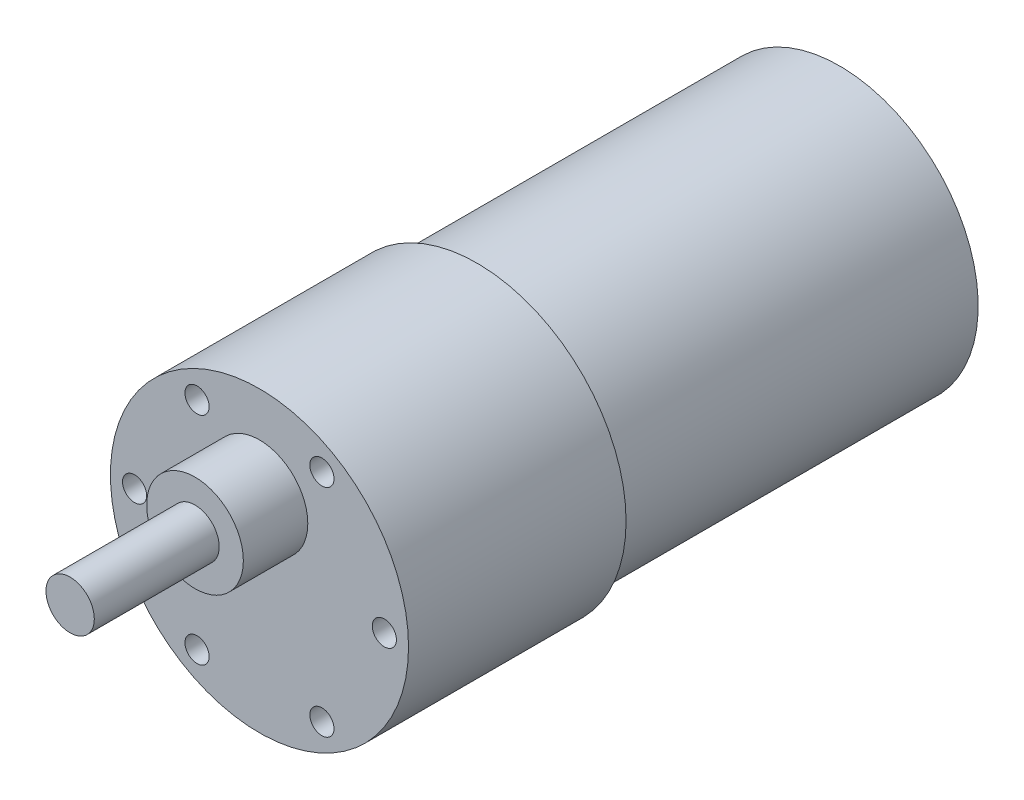
ISO-10303-21;
HEADER;
FILE_DESCRIPTION(('STEP AP214'),'2;1');
FILE_NAME('part.step','',(''),(''),'','','');
FILE_SCHEMA(('AUTOMOTIVE_DESIGN { 1 0 10303 214 1 1 1 1 }'));
ENDSEC;
DATA;
#1=APPLICATION_CONTEXT('core data for automotive mechanical design processes');
#2=APPLICATION_PROTOCOL_DEFINITION('international standard','automotive_design',2000,#1);
#3=PRODUCT_CONTEXT('',#1,'mechanical');
#4=PRODUCT('Part','Part','',(#3));
#5=PRODUCT_RELATED_PRODUCT_CATEGORY('part','',(#4));
#6=PRODUCT_DEFINITION_FORMATION('','',#4);
#7=PRODUCT_DEFINITION_CONTEXT('part definition',#1,'design');
#8=PRODUCT_DEFINITION('design','',#6,#7);
#9=PRODUCT_DEFINITION_SHAPE('','',#8);
#10=(LENGTH_UNIT() NAMED_UNIT(*) SI_UNIT(.MILLI.,.METRE.));
#11=(NAMED_UNIT(*) PLANE_ANGLE_UNIT() SI_UNIT($,.RADIAN.));
#12=(NAMED_UNIT(*) SI_UNIT($,.STERADIAN.) SOLID_ANGLE_UNIT());
#13=UNCERTAINTY_MEASURE_WITH_UNIT(LENGTH_MEASURE(1.E-05),#10,'distance_accuracy_value','');
#14=(GEOMETRIC_REPRESENTATION_CONTEXT(3) GLOBAL_UNCERTAINTY_ASSIGNED_CONTEXT((#13)) GLOBAL_UNIT_ASSIGNED_CONTEXT((#10,
#11,#12)) REPRESENTATION_CONTEXT('',''));
#15=CARTESIAN_POINT('',(0.,0.,0.));
#16=DIRECTION('',(0.,0.,1.));
#17=DIRECTION('',(1.,0.,0.));
#18=AXIS2_PLACEMENT_3D('',#15,#16,#17);
#19=CARTESIAN_POINT('',(0.,0.,45.));
#20=DIRECTION('',(0.,0.,-1.));
#21=DIRECTION('',(-1.,0.,0.));
#22=AXIS2_PLACEMENT_3D('',#19,#20,#21);
#23=CYLINDRICAL_SURFACE('',#22,17.2);
#24=CARTESIAN_POINT('',(0.,0.,45.));
#25=DIRECTION('',(0.,0.,1.));
#26=DIRECTION('',(1.,0.,0.));
#27=AXIS2_PLACEMENT_3D('',#24,#25,#26);
#28=CIRCLE('',#27,17.2);
#29=CARTESIAN_POINT('',(-17.2,0.,45.));
#30=VERTEX_POINT('',#29);
#31=EDGE_CURVE('E10',#30,#30,#28,.T.);
#32=CARTESIAN_POINT('',(0.,0.,0.));
#33=DIRECTION('',(0.,0.,1.));
#34=DIRECTION('',(1.,0.,0.));
#35=AXIS2_PLACEMENT_3D('',#32,#33,#34);
#36=CIRCLE('',#35,17.2);
#37=CARTESIAN_POINT('',(-17.2,0.,0.));
#38=VERTEX_POINT('',#37);
#39=EDGE_CURVE('E36',#38,#38,#36,.T.);
#40=CARTESIAN_POINT('',(-17.2,0.,45.));
#41=CARTESIAN_POINT('',(-17.2,0.,44.53125));
#42=CARTESIAN_POINT('',(-17.2,0.,44.0625));
#43=CARTESIAN_POINT('',(-17.2,0.,43.125));
#44=CARTESIAN_POINT('',(-17.2,0.,42.65625));
#45=CARTESIAN_POINT('',(-17.2,0.,41.71875));
#46=CARTESIAN_POINT('',(-17.2,0.,41.25));
#47=CARTESIAN_POINT('',(-17.2,0.,40.3125));
#48=CARTESIAN_POINT('',(-17.2,0.,39.84375));
#49=CARTESIAN_POINT('',(-17.2,0.,38.90625));
#50=CARTESIAN_POINT('',(-17.2,0.,38.4375));
#51=CARTESIAN_POINT('',(-17.2,0.,37.5));
#52=CARTESIAN_POINT('',(-17.2,0.,37.03125));
#53=CARTESIAN_POINT('',(-17.2,0.,36.09375));
#54=CARTESIAN_POINT('',(-17.2,0.,35.625));
#55=CARTESIAN_POINT('',(-17.2,0.,34.6875));
#56=CARTESIAN_POINT('',(-17.2,0.,34.21875));
#57=CARTESIAN_POINT('',(-17.2,0.,33.28125));
#58=CARTESIAN_POINT('',(-17.2,0.,32.8125));
#59=CARTESIAN_POINT('',(-17.2,0.,31.875));
#60=CARTESIAN_POINT('',(-17.2,0.,31.40625));
#61=CARTESIAN_POINT('',(-17.2,0.,30.46875));
#62=CARTESIAN_POINT('',(-17.2,0.,30.));
#63=CARTESIAN_POINT('',(-17.2,0.,29.0625));
#64=CARTESIAN_POINT('',(-17.2,0.,28.59375));
#65=CARTESIAN_POINT('',(-17.2,0.,27.65625));
#66=CARTESIAN_POINT('',(-17.2,0.,27.1875));
#67=CARTESIAN_POINT('',(-17.2,0.,26.25));
#68=CARTESIAN_POINT('',(-17.2,0.,25.78125));
#69=CARTESIAN_POINT('',(-17.2,0.,24.84375));
#70=CARTESIAN_POINT('',(-17.2,0.,24.375));
#71=CARTESIAN_POINT('',(-17.2,0.,23.4375));
#72=CARTESIAN_POINT('',(-17.2,0.,22.96875));
#73=CARTESIAN_POINT('',(-17.2,0.,22.03125));
#74=CARTESIAN_POINT('',(-17.2,0.,21.5625));
#75=CARTESIAN_POINT('',(-17.2,0.,20.625));
#76=CARTESIAN_POINT('',(-17.2,0.,20.15625));
#77=CARTESIAN_POINT('',(-17.2,0.,19.21875));
#78=CARTESIAN_POINT('',(-17.2,0.,18.75));
#79=CARTESIAN_POINT('',(-17.2,0.,17.8125));
#80=CARTESIAN_POINT('',(-17.2,0.,17.34375));
#81=CARTESIAN_POINT('',(-17.2,0.,16.40625));
#82=CARTESIAN_POINT('',(-17.2,0.,15.9375));
#83=CARTESIAN_POINT('',(-17.2,0.,15.));
#84=CARTESIAN_POINT('',(-17.2,0.,14.53125));
#85=CARTESIAN_POINT('',(-17.2,0.,13.59375));
#86=CARTESIAN_POINT('',(-17.2,0.,13.125));
#87=CARTESIAN_POINT('',(-17.2,0.,12.1875));
#88=CARTESIAN_POINT('',(-17.2,0.,11.71875));
#89=CARTESIAN_POINT('',(-17.2,0.,10.78125));
#90=CARTESIAN_POINT('',(-17.2,0.,10.3125));
#91=CARTESIAN_POINT('',(-17.2,0.,9.37499999999999));
#92=CARTESIAN_POINT('',(-17.2,0.,8.90624999999999));
#93=CARTESIAN_POINT('',(-17.2,0.,7.96874999999999));
#94=CARTESIAN_POINT('',(-17.2,0.,7.5));
#95=CARTESIAN_POINT('',(-17.2,0.,6.56249999999999));
#96=CARTESIAN_POINT('',(-17.2,0.,6.09374999999999));
#97=CARTESIAN_POINT('',(-17.2,0.,5.15624999999999));
#98=CARTESIAN_POINT('',(-17.2,0.,4.68749999999999));
#99=CARTESIAN_POINT('',(-17.2,0.,3.74999999999999));
#100=CARTESIAN_POINT('',(-17.2,0.,3.28124999999999));
#101=CARTESIAN_POINT('',(-17.2,0.,2.34374999999999));
#102=CARTESIAN_POINT('',(-17.2,0.,1.87499999999999));
#103=CARTESIAN_POINT('',(-17.2,0.,0.937499999999992));
#104=CARTESIAN_POINT('',(-17.2,0.,0.468749999999993));
#105=CARTESIAN_POINT('',(-17.2,0.,0.));
#106=B_SPLINE_CURVE_WITH_KNOTS('',3,(#40,#41,#42,#43,#44,#45,#46,#47,#48,#49,#50,#51,#52,#53,
#54,#55,#56,#57,#58,#59,#60,#61,#62,#63,#64,#65,#66,#67,#68,#69,#70,#71,#72,#73,#74,#75,#76,#77,
#78,#79,#80,#81,#82,#83,#84,#85,#86,#87,#88,#89,#90,#91,#92,#93,#94,#95,#96,#97,#98,#99,#100,
#101,#102,#103,#104,#105),.UNSPECIFIED.,.F.,.F.,(4,2,2,2,2,2,2,2,2,2,2,2,2,2,2,2,2,2,2,2,2,2,2,
2,2,2,2,2,2,2,2,2,4),(0.,1.40625,2.8125,4.21874999999999,5.625,7.03125,8.43749999999999,9.84375,
11.25,12.65625,14.0625,15.46875,16.875,18.28125,19.6875,21.09375,22.5,23.90625,25.3125,26.71875,
28.125,29.53125,30.9375,32.34375,33.75,35.15625,36.5625,37.96875,39.375,40.78125,42.1875,
43.59375,45.),.UNSPECIFIED.);
#107=EDGE_CURVE('BSEAM33',#30,#38,#106,.T.);
#108=ORIENTED_EDGE('',*,*,#31,.F.);
#109=ORIENTED_EDGE('',*,*,#39,.T.);
#110=ORIENTED_EDGE('',*,*,#107,.T.);
#111=ORIENTED_EDGE('',*,*,#107,.F.);
#112=EDGE_LOOP('',(#108,#110,#109,#111));
#113=FACE_BOUND('',#112,.T.);
#114=ADVANCED_FACE('F33',(#113),#23,.T.);
#115=CARTESIAN_POINT('',(0.,0.,0.));
#116=DIRECTION('',(0.,0.,1.));
#117=DIRECTION('',(1.,0.,0.));
#118=AXIS2_PLACEMENT_3D('',#115,#116,#117);
#119=PLANE('',#118);
#120=ORIENTED_EDGE('',*,*,#39,.F.);
#121=EDGE_LOOP('',(#120));
#122=FACE_BOUND('',#121,.T.);
#123=ADVANCED_FACE('F142',(#122),#119,.F.);
#124=CARTESIAN_POINT('',(0.,0.,72.));
#125=DIRECTION('',(0.,0.,-1.));
#126=DIRECTION('',(-1.,0.,0.));
#127=AXIS2_PLACEMENT_3D('',#124,#125,#126);
#128=CYLINDRICAL_SURFACE('',#127,18.5);
#129=CARTESIAN_POINT('',(0.,0.,72.));
#130=DIRECTION('',(0.,0.,1.));
#131=DIRECTION('',(1.,0.,0.));
#132=AXIS2_PLACEMENT_3D('',#129,#130,#131);
#133=CIRCLE('',#132,18.5);
#134=CARTESIAN_POINT('',(18.5,0.,72.));
#135=VERTEX_POINT('',#134);
#136=EDGE_CURVE('E43',#135,#135,#133,.T.);
#137=ORIENTED_EDGE('',*,*,#136,.F.);
#138=EDGE_LOOP('',(#137));
#139=FACE_BOUND('',#138,.T.);
#140=CARTESIAN_POINT('',(0.,0.,45.));
#141=DIRECTION('',(0.,0.,1.));
#142=DIRECTION('',(1.,0.,0.));
#143=AXIS2_PLACEMENT_3D('',#140,#141,#142);
#144=CIRCLE('',#143,18.5);
#145=CARTESIAN_POINT('',(18.5,0.,45.));
#146=VERTEX_POINT('',#145);
#147=EDGE_CURVE('E45',#146,#146,#144,.T.);
#148=ORIENTED_EDGE('',*,*,#147,.T.);
#149=EDGE_LOOP('',(#148));
#150=FACE_BOUND('',#149,.T.);
#151=ADVANCED_FACE('F124',(#139,#150),#128,.T.);
#152=CARTESIAN_POINT('',(0.,0.,72.));
#153=DIRECTION('',(0.,0.,1.));
#154=DIRECTION('',(1.,0.,0.));
#155=AXIS2_PLACEMENT_3D('',#152,#153,#154);
#156=PLANE('',#155);
#157=CARTESIAN_POINT('',(0.,7.,72.));
#158=DIRECTION('',(0.,0.,1.));
#159=DIRECTION('',(1.,0.,0.));
#160=AXIS2_PLACEMENT_3D('',#157,#158,#159);
#161=CIRCLE('',#160,6.);
#162=CARTESIAN_POINT('',(6.,7.,72.));
#163=VERTEX_POINT('',#162);
#164=EDGE_CURVE('E87',#163,#163,#161,.T.);
#165=ORIENTED_EDGE('',*,*,#164,.F.);
#166=EDGE_LOOP('',(#165));
#167=FACE_BOUND('',#166,.T.);
#168=CARTESIAN_POINT('',(-7.75000000000001,13.4233937586588,72.));
#169=DIRECTION('',(0.,0.,1.));
#170=DIRECTION('',(1.,0.,0.));
#171=AXIS2_PLACEMENT_3D('',#168,#169,#170);
#172=CIRCLE('',#171,1.5);
#173=CARTESIAN_POINT('',(-6.25000000000001,13.4233937586588,72.));
#174=VERTEX_POINT('',#173);
#175=EDGE_CURVE('E82',#174,#174,#172,.T.);
#176=ORIENTED_EDGE('',*,*,#175,.F.);
#177=EDGE_LOOP('',(#176));
#178=FACE_BOUND('',#177,.T.);
#179=CARTESIAN_POINT('',(7.75,13.4233937586588,72.));
#180=DIRECTION('',(0.,0.,1.));
#181=DIRECTION('',(1.,0.,0.));
#182=AXIS2_PLACEMENT_3D('',#179,#180,#181);
#183=CIRCLE('',#182,1.5);
#184=CARTESIAN_POINT('',(9.25,13.4233937586588,72.));
#185=VERTEX_POINT('',#184);
#186=EDGE_CURVE('E76',#185,#185,#183,.T.);
#187=ORIENTED_EDGE('',*,*,#186,.F.);
#188=EDGE_LOOP('',(#187));
#189=FACE_BOUND('',#188,.T.);
#190=CARTESIAN_POINT('',(15.5,0.,72.));
#191=DIRECTION('',(0.,0.,1.));
#192=DIRECTION('',(1.,0.,0.));
#193=AXIS2_PLACEMENT_3D('',#190,#191,#192);
#194=CIRCLE('',#193,1.5);
#195=CARTESIAN_POINT('',(17.,0.,72.));
#196=VERTEX_POINT('',#195);
#197=EDGE_CURVE('E70',#196,#196,#194,.T.);
#198=ORIENTED_EDGE('',*,*,#197,.F.);
#199=EDGE_LOOP('',(#198));
#200=FACE_BOUND('',#199,.T.);
#201=CARTESIAN_POINT('',(7.75000000000001,-13.4233937586588,72.));
#202=DIRECTION('',(0.,0.,1.));
#203=DIRECTION('',(1.,0.,0.));
#204=AXIS2_PLACEMENT_3D('',#201,#202,#203);
#205=CIRCLE('',#204,1.5);
#206=CARTESIAN_POINT('',(9.25000000000001,-13.4233937586588,72.));
#207=VERTEX_POINT('',#206);
#208=EDGE_CURVE('E64',#207,#207,#205,.T.);
#209=ORIENTED_EDGE('',*,*,#208,.F.);
#210=EDGE_LOOP('',(#209));
#211=FACE_BOUND('',#210,.T.);
#212=CARTESIAN_POINT('',(-7.74999999999999,-13.4233937586588,72.));
#213=DIRECTION('',(0.,0.,1.));
#214=DIRECTION('',(1.,0.,0.));
#215=AXIS2_PLACEMENT_3D('',#212,#213,#214);
#216=CIRCLE('',#215,1.5);
#217=CARTESIAN_POINT('',(-6.24999999999999,-13.4233937586588,72.));
#218=VERTEX_POINT('',#217);
#219=EDGE_CURVE('E57',#218,#218,#216,.T.);
#220=ORIENTED_EDGE('',*,*,#219,.F.);
#221=EDGE_LOOP('',(#220));
#222=FACE_BOUND('',#221,.T.);
#223=CARTESIAN_POINT('',(-15.5,0.,72.));
#224=DIRECTION('',(0.,0.,1.));
#225=DIRECTION('',(1.,0.,0.));
#226=AXIS2_PLACEMENT_3D('',#223,#224,#225);
#227=CIRCLE('',#226,1.5);
#228=CARTESIAN_POINT('',(-14.,0.,72.));
#229=VERTEX_POINT('',#228);
#230=EDGE_CURVE('E51',#229,#229,#227,.T.);
#231=ORIENTED_EDGE('',*,*,#230,.F.);
#232=EDGE_LOOP('',(#231));
#233=FACE_BOUND('',#232,.T.);
#234=ORIENTED_EDGE('',*,*,#136,.T.);
#235=EDGE_LOOP('',(#234));
#236=FACE_BOUND('',#235,.T.);
#237=ADVANCED_FACE('F120',(#167,#178,#189,#200,#211,#222,#233,#236),#156,.T.);
#238=CARTESIAN_POINT('',(0.,0.,45.));
#239=DIRECTION('',(0.,0.,1.));
#240=DIRECTION('',(1.,0.,0.));
#241=AXIS2_PLACEMENT_3D('',#238,#239,#240);
#242=PLANE('',#241);
#243=ORIENTED_EDGE('',*,*,#31,.T.);
#244=EDGE_LOOP('',(#243));
#245=FACE_BOUND('',#244,.T.);
#246=ORIENTED_EDGE('',*,*,#147,.F.);
#247=EDGE_LOOP('',(#246));
#248=FACE_BOUND('',#247,.T.);
#249=ADVANCED_FACE('F123',(#245,#248),#242,.F.);
#250=CARTESIAN_POINT('',(-15.5,0.,62.));
#251=DIRECTION('',(0.,0.,1.));
#252=DIRECTION('',(1.,0.,0.));
#253=AXIS2_PLACEMENT_3D('',#250,#251,#252);
#254=CYLINDRICAL_SURFACE('',#253,1.5);
#255=CARTESIAN_POINT('',(-15.5,0.,62.));
#256=DIRECTION('',(0.,0.,1.));
#257=DIRECTION('',(1.,0.,0.));
#258=AXIS2_PLACEMENT_3D('',#255,#256,#257);
#259=CIRCLE('',#258,1.5);
#260=CARTESIAN_POINT('',(-14.,0.,62.));
#261=VERTEX_POINT('',#260);
#262=EDGE_CURVE('E48',#261,#261,#259,.T.);
#263=ORIENTED_EDGE('',*,*,#262,.F.);
#264=EDGE_LOOP('',(#263));
#265=FACE_BOUND('',#264,.T.);
#266=ORIENTED_EDGE('',*,*,#230,.T.);
#267=EDGE_LOOP('',(#266));
#268=FACE_BOUND('',#267,.T.);
#269=ADVANCED_FACE('F147',(#265,#268),#254,.F.);
#270=CARTESIAN_POINT('',(-15.5,0.,62.));
#271=DIRECTION('',(0.,0.,1.));
#272=DIRECTION('',(1.,0.,0.));
#273=AXIS2_PLACEMENT_3D('',#270,#271,#272);
#274=PLANE('',#273);
#275=ORIENTED_EDGE('',*,*,#262,.T.);
#276=EDGE_LOOP('',(#275));
#277=FACE_BOUND('',#276,.T.);
#278=ADVANCED_FACE('F152',(#277),#274,.T.);
#279=CARTESIAN_POINT('',(-7.74999999999999,-13.4233937586588,62.));
#280=DIRECTION('',(0.,0.,1.));
#281=DIRECTION('',(1.,0.,0.));
#282=AXIS2_PLACEMENT_3D('',#279,#280,#281);
#283=CYLINDRICAL_SURFACE('',#282,1.5);
#284=CARTESIAN_POINT('',(-7.74999999999999,-13.4233937586588,62.));
#285=DIRECTION('',(0.,0.,1.));
#286=DIRECTION('',(1.,0.,0.));
#287=AXIS2_PLACEMENT_3D('',#284,#285,#286);
#288=CIRCLE('',#287,1.5);
#289=CARTESIAN_POINT('',(-6.24999999999999,-13.4233937586588,62.));
#290=VERTEX_POINT('',#289);
#291=EDGE_CURVE('E60',#290,#290,#288,.T.);
#292=ORIENTED_EDGE('',*,*,#291,.F.);
#293=EDGE_LOOP('',(#292));
#294=FACE_BOUND('',#293,.T.);
#295=ORIENTED_EDGE('',*,*,#219,.T.);
#296=EDGE_LOOP('',(#295));
#297=FACE_BOUND('',#296,.T.);
#298=ADVANCED_FACE('F243',(#294,#297),#283,.F.);
#299=CARTESIAN_POINT('',(-7.74999999999999,-13.4233937586588,62.));
#300=DIRECTION('',(0.,0.,1.));
#301=DIRECTION('',(1.,0.,0.));
#302=AXIS2_PLACEMENT_3D('',#299,#300,#301);
#303=PLANE('',#302);
#304=ORIENTED_EDGE('',*,*,#291,.T.);
#305=EDGE_LOOP('',(#304));
#306=FACE_BOUND('',#305,.T.);
#307=ADVANCED_FACE('F239',(#306),#303,.T.);
#308=CARTESIAN_POINT('',(7.75000000000001,-13.4233937586588,62.));
#309=DIRECTION('',(0.,0.,1.));
#310=DIRECTION('',(1.,0.,0.));
#311=AXIS2_PLACEMENT_3D('',#308,#309,#310);
#312=CYLINDRICAL_SURFACE('',#311,1.5);
#313=CARTESIAN_POINT('',(7.75000000000001,-13.4233937586588,62.));
#314=DIRECTION('',(0.,0.,1.));
#315=DIRECTION('',(1.,0.,0.));
#316=AXIS2_PLACEMENT_3D('',#313,#314,#315);
#317=CIRCLE('',#316,1.5);
#318=CARTESIAN_POINT('',(9.25000000000001,-13.4233937586588,62.));
#319=VERTEX_POINT('',#318);
#320=EDGE_CURVE('E67',#319,#319,#317,.T.);
#321=ORIENTED_EDGE('',*,*,#320,.F.);
#322=EDGE_LOOP('',(#321));
#323=FACE_BOUND('',#322,.T.);
#324=ORIENTED_EDGE('',*,*,#208,.T.);
#325=EDGE_LOOP('',(#324));
#326=FACE_BOUND('',#325,.T.);
#327=ADVANCED_FACE('F235',(#323,#326),#312,.F.);
#328=CARTESIAN_POINT('',(7.75000000000001,-13.4233937586588,62.));
#329=DIRECTION('',(0.,0.,1.));
#330=DIRECTION('',(1.,0.,0.));
#331=AXIS2_PLACEMENT_3D('',#328,#329,#330);
#332=PLANE('',#331);
#333=ORIENTED_EDGE('',*,*,#320,.T.);
#334=EDGE_LOOP('',(#333));
#335=FACE_BOUND('',#334,.T.);
#336=ADVANCED_FACE('F231',(#335),#332,.T.);
#337=CARTESIAN_POINT('',(15.5,0.,62.));
#338=DIRECTION('',(0.,0.,1.));
#339=DIRECTION('',(1.,0.,0.));
#340=AXIS2_PLACEMENT_3D('',#337,#338,#339);
#341=CYLINDRICAL_SURFACE('',#340,1.5);
#342=CARTESIAN_POINT('',(15.5,0.,62.));
#343=DIRECTION('',(0.,0.,1.));
#344=DIRECTION('',(1.,0.,0.));
#345=AXIS2_PLACEMENT_3D('',#342,#343,#344);
#346=CIRCLE('',#345,1.5);
#347=CARTESIAN_POINT('',(17.,0.,62.));
#348=VERTEX_POINT('',#347);
#349=EDGE_CURVE('E73',#348,#348,#346,.T.);
#350=ORIENTED_EDGE('',*,*,#349,.F.);
#351=EDGE_LOOP('',(#350));
#352=FACE_BOUND('',#351,.T.);
#353=ORIENTED_EDGE('',*,*,#197,.T.);
#354=EDGE_LOOP('',(#353));
#355=FACE_BOUND('',#354,.T.);
#356=ADVANCED_FACE('F227',(#352,#355),#341,.F.);
#357=CARTESIAN_POINT('',(15.5,0.,62.));
#358=DIRECTION('',(0.,0.,1.));
#359=DIRECTION('',(1.,0.,0.));
#360=AXIS2_PLACEMENT_3D('',#357,#358,#359);
#361=PLANE('',#360);
#362=ORIENTED_EDGE('',*,*,#349,.T.);
#363=EDGE_LOOP('',(#362));
#364=FACE_BOUND('',#363,.T.);
#365=ADVANCED_FACE('F223',(#364),#361,.T.);
#366=CARTESIAN_POINT('',(7.75,13.4233937586588,62.));
#367=DIRECTION('',(0.,0.,1.));
#368=DIRECTION('',(1.,0.,0.));
#369=AXIS2_PLACEMENT_3D('',#366,#367,#368);
#370=CYLINDRICAL_SURFACE('',#369,1.5);
#371=CARTESIAN_POINT('',(7.75,13.4233937586588,62.));
#372=DIRECTION('',(0.,0.,1.));
#373=DIRECTION('',(1.,0.,0.));
#374=AXIS2_PLACEMENT_3D('',#371,#372,#373);
#375=CIRCLE('',#374,1.5);
#376=CARTESIAN_POINT('',(9.25,13.4233937586588,62.));
#377=VERTEX_POINT('',#376);
#378=EDGE_CURVE('E79',#377,#377,#375,.T.);
#379=ORIENTED_EDGE('',*,*,#378,.F.);
#380=EDGE_LOOP('',(#379));
#381=FACE_BOUND('',#380,.T.);
#382=ORIENTED_EDGE('',*,*,#186,.T.);
#383=EDGE_LOOP('',(#382));
#384=FACE_BOUND('',#383,.T.);
#385=ADVANCED_FACE('F219',(#381,#384),#370,.F.);
#386=CARTESIAN_POINT('',(7.75,13.4233937586588,62.));
#387=DIRECTION('',(0.,0.,1.));
#388=DIRECTION('',(1.,0.,0.));
#389=AXIS2_PLACEMENT_3D('',#386,#387,#388);
#390=PLANE('',#389);
#391=ORIENTED_EDGE('',*,*,#378,.T.);
#392=EDGE_LOOP('',(#391));
#393=FACE_BOUND('',#392,.T.);
#394=ADVANCED_FACE('F215',(#393),#390,.T.);
#395=CARTESIAN_POINT('',(-7.75000000000001,13.4233937586588,62.));
#396=DIRECTION('',(0.,0.,1.));
#397=DIRECTION('',(1.,0.,0.));
#398=AXIS2_PLACEMENT_3D('',#395,#396,#397);
#399=CYLINDRICAL_SURFACE('',#398,1.5);
#400=CARTESIAN_POINT('',(-7.75000000000001,13.4233937586588,62.));
#401=DIRECTION('',(0.,0.,1.));
#402=DIRECTION('',(1.,0.,0.));
#403=AXIS2_PLACEMENT_3D('',#400,#401,#402);
#404=CIRCLE('',#403,1.5);
#405=CARTESIAN_POINT('',(-6.25000000000001,13.4233937586588,62.));
#406=VERTEX_POINT('',#405);
#407=EDGE_CURVE('E54',#406,#406,#404,.T.);
#408=ORIENTED_EDGE('',*,*,#407,.F.);
#409=EDGE_LOOP('',(#408));
#410=FACE_BOUND('',#409,.T.);
#411=ORIENTED_EDGE('',*,*,#175,.T.);
#412=EDGE_LOOP('',(#411));
#413=FACE_BOUND('',#412,.T.);
#414=ADVANCED_FACE('F211',(#410,#413),#399,.F.);
#415=CARTESIAN_POINT('',(-7.75000000000001,13.4233937586588,62.));
#416=DIRECTION('',(0.,0.,1.));
#417=DIRECTION('',(1.,0.,0.));
#418=AXIS2_PLACEMENT_3D('',#415,#416,#417);
#419=PLANE('',#418);
#420=ORIENTED_EDGE('',*,*,#407,.T.);
#421=EDGE_LOOP('',(#420));
#422=FACE_BOUND('',#421,.T.);
#423=ADVANCED_FACE('F116',(#422),#419,.T.);
#424=CARTESIAN_POINT('',(0.,7.,80.));
#425=DIRECTION('',(0.,0.,-1.));
#426=DIRECTION('',(-1.,0.,0.));
#427=AXIS2_PLACEMENT_3D('',#424,#425,#426);
#428=CYLINDRICAL_SURFACE('',#427,6.);
#429=CARTESIAN_POINT('',(0.,7.,80.));
#430=DIRECTION('',(0.,0.,1.));
#431=DIRECTION('',(1.,0.,0.));
#432=AXIS2_PLACEMENT_3D('',#429,#430,#431);
#433=CIRCLE('',#432,6.);
#434=CARTESIAN_POINT('',(6.,7.,80.));
#435=VERTEX_POINT('',#434);
#436=EDGE_CURVE('E61',#435,#435,#433,.T.);
#437=ORIENTED_EDGE('',*,*,#436,.F.);
#438=EDGE_LOOP('',(#437));
#439=FACE_BOUND('',#438,.T.);
#440=ORIENTED_EDGE('',*,*,#164,.T.);
#441=EDGE_LOOP('',(#440));
#442=FACE_BOUND('',#441,.T.);
#443=ADVANCED_FACE('F110',(#439,#442),#428,.T.);
#444=CARTESIAN_POINT('',(0.,7.,80.));
#445=DIRECTION('',(0.,0.,1.));
#446=DIRECTION('',(1.,0.,0.));
#447=AXIS2_PLACEMENT_3D('',#444,#445,#446);
#448=PLANE('',#447);
#449=CARTESIAN_POINT('',(0.,7.,80.));
#450=DIRECTION('',(0.,0.,1.));
#451=DIRECTION('',(1.,0.,0.));
#452=AXIS2_PLACEMENT_3D('',#449,#450,#451);
#453=CIRCLE('',#452,3.);
#454=CARTESIAN_POINT('',(3.,7.,80.));
#455=VERTEX_POINT('',#454);
#456=EDGE_CURVE('E93',#455,#455,#453,.T.);
#457=ORIENTED_EDGE('',*,*,#456,.F.);
#458=EDGE_LOOP('',(#457));
#459=FACE_BOUND('',#458,.T.);
#460=ORIENTED_EDGE('',*,*,#436,.T.);
#461=EDGE_LOOP('',(#460));
#462=FACE_BOUND('',#461,.T.);
#463=ADVANCED_FACE('F104',(#459,#462),#448,.T.);
#464=CARTESIAN_POINT('',(0.,7.,95.5));
#465=DIRECTION('',(0.,0.,-1.));
#466=DIRECTION('',(-1.,0.,0.));
#467=AXIS2_PLACEMENT_3D('',#464,#465,#466);
#468=CYLINDRICAL_SURFACE('',#467,3.);
#469=CARTESIAN_POINT('',(0.,7.,95.5));
#470=DIRECTION('',(0.,0.,1.));
#471=DIRECTION('',(1.,0.,0.));
#472=AXIS2_PLACEMENT_3D('',#469,#470,#471);
#473=CIRCLE('',#472,3.);
#474=CARTESIAN_POINT('',(3.,7.,95.5));
#475=VERTEX_POINT('',#474);
#476=EDGE_CURVE('E90',#475,#475,#473,.T.);
#477=ORIENTED_EDGE('',*,*,#476,.F.);
#478=EDGE_LOOP('',(#477));
#479=FACE_BOUND('',#478,.T.);
#480=ORIENTED_EDGE('',*,*,#456,.T.);
#481=EDGE_LOOP('',(#480));
#482=FACE_BOUND('',#481,.T.);
#483=ADVANCED_FACE('F101',(#479,#482),#468,.T.);
#484=CARTESIAN_POINT('',(0.,7.,95.5));
#485=DIRECTION('',(0.,0.,1.));
#486=DIRECTION('',(1.,0.,0.));
#487=AXIS2_PLACEMENT_3D('',#484,#485,#486);
#488=PLANE('',#487);
#489=ORIENTED_EDGE('',*,*,#476,.T.);
#490=EDGE_LOOP('',(#489));
#491=FACE_BOUND('',#490,.T.);
#492=ADVANCED_FACE('F99',(#491),#488,.T.);
#493=CLOSED_SHELL('',(#114,#123,#151,#237,#249,#269,#278,#298,#307,#327,#336,#356,#365,#385,
#394,#414,#423,#443,#463,#483,#492));
#494=MANIFOLD_SOLID_BREP('B2',#493);
#495=ADVANCED_BREP_SHAPE_REPRESENTATION('',(#18,#494),#14);
#496=SHAPE_DEFINITION_REPRESENTATION(#9,#495);
ENDSEC;
END-ISO-10303-21;
